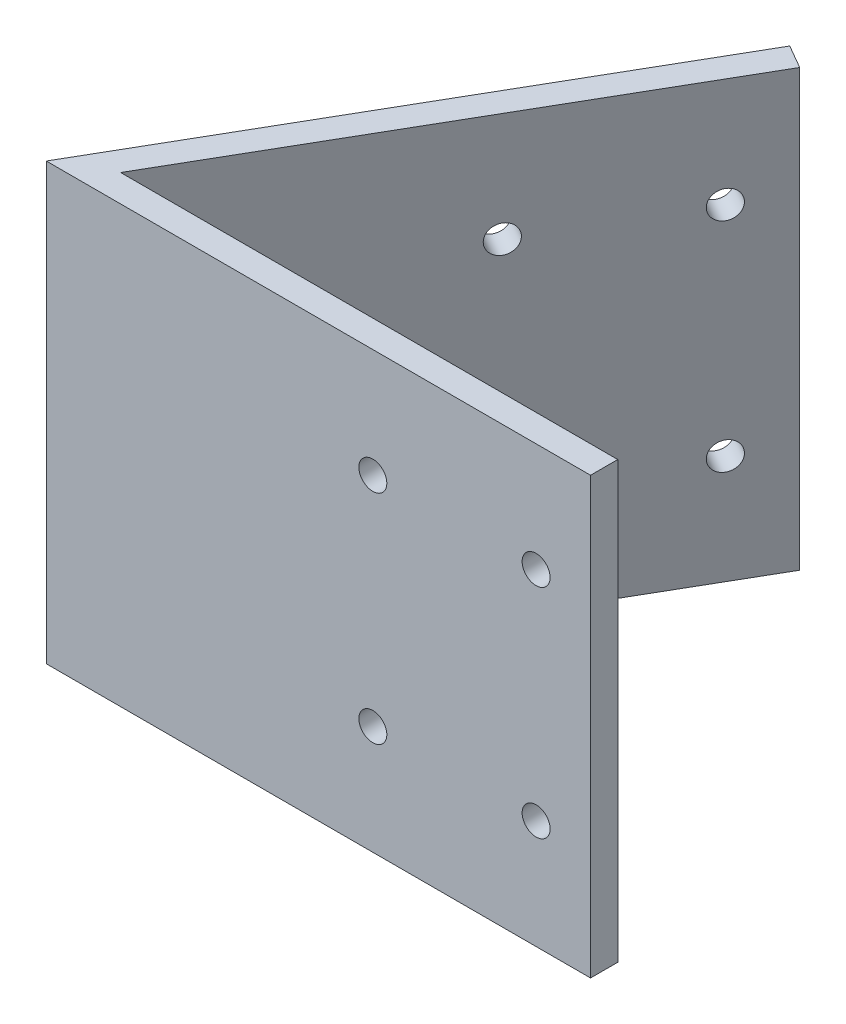
ISO-10303-21;
HEADER;
FILE_DESCRIPTION(('STEP AP214'),'2;1');
FILE_NAME('part.step','',(''),(''),'','','');
FILE_SCHEMA(('AUTOMOTIVE_DESIGN { 1 0 10303 214 1 1 1 1 }'));
ENDSEC;
DATA;
#1=APPLICATION_CONTEXT('core data for automotive mechanical design processes');
#2=APPLICATION_PROTOCOL_DEFINITION('international standard','automotive_design',2000,#1);
#3=PRODUCT_CONTEXT('',#1,'mechanical');
#4=PRODUCT('Part','Part','',(#3));
#5=PRODUCT_RELATED_PRODUCT_CATEGORY('part','',(#4));
#6=PRODUCT_DEFINITION_FORMATION('','',#4);
#7=PRODUCT_DEFINITION_CONTEXT('part definition',#1,'design');
#8=PRODUCT_DEFINITION('design','',#6,#7);
#9=PRODUCT_DEFINITION_SHAPE('','',#8);
#10=(LENGTH_UNIT() NAMED_UNIT(*) SI_UNIT(.MILLI.,.METRE.));
#11=(NAMED_UNIT(*) PLANE_ANGLE_UNIT() SI_UNIT($,.RADIAN.));
#12=(NAMED_UNIT(*) SI_UNIT($,.STERADIAN.) SOLID_ANGLE_UNIT());
#13=UNCERTAINTY_MEASURE_WITH_UNIT(LENGTH_MEASURE(1.E-05),#10,'distance_accuracy_value','');
#14=(GEOMETRIC_REPRESENTATION_CONTEXT(3) GLOBAL_UNCERTAINTY_ASSIGNED_CONTEXT((#13)) GLOBAL_UNIT_ASSIGNED_CONTEXT((#10,
#11,#12)) REPRESENTATION_CONTEXT('',''));
#15=CARTESIAN_POINT('',(0.,0.,0.));
#16=DIRECTION('',(0.,0.,1.));
#17=DIRECTION('',(1.,0.,0.));
#18=AXIS2_PLACEMENT_3D('',#15,#16,#17);
#19=CARTESIAN_POINT('',(63.5,50.8,0.));
#20=DIRECTION('',(0.,0.,-1.));
#21=DIRECTION('',(-1.,0.,0.));
#22=AXIS2_PLACEMENT_3D('',#19,#20,#21);
#23=PLANE('',#22);
#24=CARTESIAN_POINT('',(57.15,12.7,0.));
#25=DIRECTION('',(0.,0.,1.));
#26=DIRECTION('',(1.,0.,0.));
#27=AXIS2_PLACEMENT_3D('',#24,#25,#26);
#28=CIRCLE('',#27,1.63194999999999);
#29=CARTESIAN_POINT('',(58.78195,12.7,0.));
#30=VERTEX_POINT('',#29);
#31=EDGE_CURVE('E162',#30,#30,#28,.T.);
#32=ORIENTED_EDGE('',*,*,#31,.F.);
#33=EDGE_LOOP('',(#32));
#34=FACE_BOUND('',#33,.T.);
#35=DIRECTION('',(1.,0.,0.));
#36=VECTOR('',#35,1.);
#37=CARTESIAN_POINT('',(63.5,0.,0.));
#38=LINE('',#37,#36);
#39=CARTESIAN_POINT('',(0.,0.,0.));
#40=VERTEX_POINT('',#39);
#41=CARTESIAN_POINT('',(63.5,0.,0.));
#42=VERTEX_POINT('',#41);
#43=EDGE_CURVE('E116',#40,#42,#38,.T.);
#44=ORIENTED_EDGE('',*,*,#43,.T.);
#45=DIRECTION('',(0.,-1.,0.));
#46=VECTOR('',#45,1.);
#47=CARTESIAN_POINT('',(63.5,50.8,0.));
#48=LINE('',#47,#46);
#49=CARTESIAN_POINT('',(63.5,50.8,0.));
#50=VERTEX_POINT('',#49);
#51=EDGE_CURVE('E11',#50,#42,#48,.T.);
#52=ORIENTED_EDGE('',*,*,#51,.F.);
#53=DIRECTION('',(1.,0.,0.));
#54=VECTOR('',#53,1.);
#55=CARTESIAN_POINT('',(63.5,50.8,0.));
#56=LINE('',#55,#54);
#57=CARTESIAN_POINT('',(0.,50.8,0.));
#58=VERTEX_POINT('',#57);
#59=EDGE_CURVE('E127',#58,#50,#56,.T.);
#60=ORIENTED_EDGE('',*,*,#59,.F.);
#61=DIRECTION('',(0.,-1.,0.));
#62=VECTOR('',#61,1.);
#63=CARTESIAN_POINT('',(0.,50.8,0.));
#64=LINE('',#63,#62);
#65=EDGE_CURVE('E112',#58,#40,#64,.T.);
#66=ORIENTED_EDGE('',*,*,#65,.T.);
#67=EDGE_LOOP('',(#44,#52,#60,#66));
#68=FACE_BOUND('',#67,.T.);
#69=CARTESIAN_POINT('',(38.1,12.7,0.));
#70=DIRECTION('',(0.,0.,1.));
#71=DIRECTION('',(1.,0.,0.));
#72=AXIS2_PLACEMENT_3D('',#69,#70,#71);
#73=CIRCLE('',#72,1.63194999999999);
#74=CARTESIAN_POINT('',(39.73195,12.7,0.));
#75=VERTEX_POINT('',#74);
#76=EDGE_CURVE('E186',#75,#75,#73,.T.);
#77=ORIENTED_EDGE('',*,*,#76,.F.);
#78=EDGE_LOOP('',(#77));
#79=FACE_BOUND('',#78,.T.);
#80=CARTESIAN_POINT('',(38.1,38.1,0.));
#81=DIRECTION('',(0.,0.,1.));
#82=DIRECTION('',(1.,0.,0.));
#83=AXIS2_PLACEMENT_3D('',#80,#81,#82);
#84=CIRCLE('',#83,1.63194999999999);
#85=CARTESIAN_POINT('',(39.73195,38.1,0.));
#86=VERTEX_POINT('',#85);
#87=EDGE_CURVE('E180',#86,#86,#84,.T.);
#88=ORIENTED_EDGE('',*,*,#87,.F.);
#89=EDGE_LOOP('',(#88));
#90=FACE_BOUND('',#89,.T.);
#91=CARTESIAN_POINT('',(57.15,38.1,0.));
#92=DIRECTION('',(0.,0.,1.));
#93=DIRECTION('',(1.,0.,0.));
#94=AXIS2_PLACEMENT_3D('',#91,#92,#93);
#95=CIRCLE('',#94,1.63194999999999);
#96=CARTESIAN_POINT('',(58.78195,38.1,0.));
#97=VERTEX_POINT('',#96);
#98=EDGE_CURVE('E168',#97,#97,#95,.T.);
#99=ORIENTED_EDGE('',*,*,#98,.F.);
#100=EDGE_LOOP('',(#99));
#101=FACE_BOUND('',#100,.T.);
#102=ADVANCED_FACE('F32',(#34,#68,#79,#90,#101),#23,.F.);
#103=CARTESIAN_POINT('',(63.5,50.8,-3.175));
#104=DIRECTION('',(-1.,0.,0.));
#105=DIRECTION('',(0.,0.,1.));
#106=AXIS2_PLACEMENT_3D('',#103,#104,#105);
#107=PLANE('',#106);
#108=DIRECTION('',(0.,0.,-1.));
#109=VECTOR('',#108,1.);
#110=CARTESIAN_POINT('',(63.5,0.,-3.175));
#111=LINE('',#110,#109);
#112=CARTESIAN_POINT('',(63.5,0.,-3.175));
#113=VERTEX_POINT('',#112);
#114=EDGE_CURVE('E119',#42,#113,#111,.T.);
#115=ORIENTED_EDGE('',*,*,#114,.T.);
#116=DIRECTION('',(0.,-1.,0.));
#117=VECTOR('',#116,1.);
#118=CARTESIAN_POINT('',(63.5,50.8,-3.175));
#119=LINE('',#118,#117);
#120=CARTESIAN_POINT('',(63.5,50.8,-3.175));
#121=VERTEX_POINT('',#120);
#122=EDGE_CURVE('E40',#121,#113,#119,.T.);
#123=ORIENTED_EDGE('',*,*,#122,.F.);
#124=DIRECTION('',(0.,0.,-1.));
#125=VECTOR('',#124,1.);
#126=CARTESIAN_POINT('',(63.5,50.8,-3.175));
#127=LINE('',#126,#125);
#128=EDGE_CURVE('E85',#50,#121,#127,.T.);
#129=ORIENTED_EDGE('',*,*,#128,.F.);
#130=ORIENTED_EDGE('',*,*,#51,.T.);
#131=EDGE_LOOP('',(#115,#123,#129,#130));
#132=FACE_BOUND('',#131,.T.);
#133=ADVANCED_FACE('F155',(#132),#107,.F.);
#134=CARTESIAN_POINT('',(5.4992613140312,50.8,-3.17499999999999));
#135=DIRECTION('',(0.,0.,1.));
#136=DIRECTION('',(1.,0.,0.));
#137=AXIS2_PLACEMENT_3D('',#134,#135,#136);
#138=PLANE('',#137);
#139=CARTESIAN_POINT('',(57.15,12.7,-3.175));
#140=DIRECTION('',(0.,0.,1.));
#141=DIRECTION('',(1.,0.,0.));
#142=AXIS2_PLACEMENT_3D('',#139,#140,#141);
#143=CIRCLE('',#142,1.63194999999999);
#144=CARTESIAN_POINT('',(58.78195,12.7,-3.175));
#145=VERTEX_POINT('',#144);
#146=EDGE_CURVE('E164',#145,#145,#143,.T.);
#147=ORIENTED_EDGE('',*,*,#146,.T.);
#148=EDGE_LOOP('',(#147));
#149=FACE_BOUND('',#148,.T.);
#150=CARTESIAN_POINT('',(57.15,38.1,-3.175));
#151=DIRECTION('',(0.,0.,1.));
#152=DIRECTION('',(1.,0.,0.));
#153=AXIS2_PLACEMENT_3D('',#150,#151,#152);
#154=CIRCLE('',#153,1.63194999999999);
#155=CARTESIAN_POINT('',(58.78195,38.1,-3.175));
#156=VERTEX_POINT('',#155);
#157=EDGE_CURVE('E177',#156,#156,#154,.T.);
#158=ORIENTED_EDGE('',*,*,#157,.T.);
#159=EDGE_LOOP('',(#158));
#160=FACE_BOUND('',#159,.T.);
#161=CARTESIAN_POINT('',(38.1,38.1,-3.17499999999999));
#162=DIRECTION('',(0.,0.,1.));
#163=DIRECTION('',(1.,0.,0.));
#164=AXIS2_PLACEMENT_3D('',#161,#162,#163);
#165=CIRCLE('',#164,1.63194999999999);
#166=CARTESIAN_POINT('',(39.73195,38.1,-3.175));
#167=VERTEX_POINT('',#166);
#168=EDGE_CURVE('E183',#167,#167,#165,.T.);
#169=ORIENTED_EDGE('',*,*,#168,.T.);
#170=EDGE_LOOP('',(#169));
#171=FACE_BOUND('',#170,.T.);
#172=CARTESIAN_POINT('',(38.1,12.7,-3.17499999999999));
#173=DIRECTION('',(0.,0.,1.));
#174=DIRECTION('',(1.,0.,0.));
#175=AXIS2_PLACEMENT_3D('',#172,#173,#174);
#176=CIRCLE('',#175,1.63194999999999);
#177=CARTESIAN_POINT('',(39.73195,12.7,-3.175));
#178=VERTEX_POINT('',#177);
#179=EDGE_CURVE('E120',#178,#178,#176,.T.);
#180=ORIENTED_EDGE('',*,*,#179,.T.);
#181=EDGE_LOOP('',(#180));
#182=FACE_BOUND('',#181,.T.);
#183=DIRECTION('',(-1.,0.,0.));
#184=VECTOR('',#183,1.);
#185=CARTESIAN_POINT('',(5.4992613140312,0.,-3.17499999999999));
#186=LINE('',#185,#184);
#187=CARTESIAN_POINT('',(5.4992613140312,0.,-3.17499999999999));
#188=VERTEX_POINT('',#187);
#189=EDGE_CURVE('E122',#113,#188,#186,.T.);
#190=ORIENTED_EDGE('',*,*,#189,.T.);
#191=DIRECTION('',(0.,-1.,0.));
#192=VECTOR('',#191,1.);
#193=CARTESIAN_POINT('',(5.4992613140312,50.8,-3.17499999999999));
#194=LINE('',#193,#192);
#195=CARTESIAN_POINT('',(5.4992613140312,50.8,-3.17499999999999));
#196=VERTEX_POINT('',#195);
#197=EDGE_CURVE('E107',#196,#188,#194,.T.);
#198=ORIENTED_EDGE('',*,*,#197,.F.);
#199=DIRECTION('',(-1.,0.,0.));
#200=VECTOR('',#199,1.);
#201=CARTESIAN_POINT('',(5.4992613140312,50.8,-3.17499999999999));
#202=LINE('',#201,#200);
#203=EDGE_CURVE('E98',#121,#196,#202,.T.);
#204=ORIENTED_EDGE('',*,*,#203,.F.);
#205=ORIENTED_EDGE('',*,*,#122,.T.);
#206=EDGE_LOOP('',(#190,#198,#204,#205));
#207=FACE_BOUND('',#206,.T.);
#208=ADVANCED_FACE('F133',(#149,#160,#171,#182,#207),#138,.F.);
#209=CARTESIAN_POINT('',(34.4996306570158,50.8,-53.4051131403117));
#210=DIRECTION('',(-0.866025403784436,0.,-0.500000000000004));
#211=DIRECTION('',(-0.500000000000004,0.,0.866025403784437));
#212=AXIS2_PLACEMENT_3D('',#209,#210,#211);
#213=PLANE('',#212);
#214=CARTESIAN_POINT('',(31.3246306570158,38.1,-47.9058518262805));
#215=DIRECTION('',(-0.866025403784436,0.,-0.500000000000004));
#216=DIRECTION('',(-0.500000000000004,0.,0.866025403784437));
#217=AXIS2_PLACEMENT_3D('',#214,#215,#216);
#218=CIRCLE('',#217,1.63194999999999);
#219=CARTESIAN_POINT('',(30.5086556570158,38.1,-46.4925416685745));
#220=VERTEX_POINT('',#219);
#221=EDGE_CURVE('E310',#220,#220,#218,.T.);
#222=ORIENTED_EDGE('',*,*,#221,.T.);
#223=EDGE_LOOP('',(#222));
#224=FACE_BOUND('',#223,.T.);
#225=CARTESIAN_POINT('',(31.3246306570158,12.7,-47.9058518262805));
#226=DIRECTION('',(-0.866025403784436,0.,-0.500000000000004));
#227=DIRECTION('',(-0.500000000000004,0.,0.866025403784437));
#228=AXIS2_PLACEMENT_3D('',#225,#226,#227);
#229=CIRCLE('',#228,1.63194999999999);
#230=CARTESIAN_POINT('',(30.5086556570158,12.7,-46.4925416685745));
#231=VERTEX_POINT('',#230);
#232=EDGE_CURVE('E314',#231,#231,#229,.T.);
#233=ORIENTED_EDGE('',*,*,#232,.T.);
#234=EDGE_LOOP('',(#233));
#235=FACE_BOUND('',#234,.T.);
#236=CARTESIAN_POINT('',(21.7996306570157,12.7,-31.408067884187));
#237=DIRECTION('',(-0.866025403784436,0.,-0.500000000000004));
#238=DIRECTION('',(-0.500000000000004,0.,0.866025403784437));
#239=AXIS2_PLACEMENT_3D('',#236,#237,#238);
#240=CIRCLE('',#239,1.63194999999999);
#241=CARTESIAN_POINT('',(20.9836556570157,12.7,-29.994757726481));
#242=VERTEX_POINT('',#241);
#243=EDGE_CURVE('E323',#242,#242,#240,.T.);
#244=ORIENTED_EDGE('',*,*,#243,.T.);
#245=EDGE_LOOP('',(#244));
#246=FACE_BOUND('',#245,.T.);
#247=CARTESIAN_POINT('',(21.7996306570157,38.1,-31.408067884187));
#248=DIRECTION('',(-0.866025403784436,0.,-0.500000000000004));
#249=DIRECTION('',(-0.500000000000004,0.,0.866025403784437));
#250=AXIS2_PLACEMENT_3D('',#247,#248,#249);
#251=CIRCLE('',#250,1.63194999999999);
#252=CARTESIAN_POINT('',(20.9836556570157,38.1,-29.994757726481));
#253=VERTEX_POINT('',#252);
#254=EDGE_CURVE('E165',#253,#253,#251,.T.);
#255=ORIENTED_EDGE('',*,*,#254,.T.);
#256=EDGE_LOOP('',(#255));
#257=FACE_BOUND('',#256,.T.);
#258=DIRECTION('',(0.500000000000004,0.,-0.866025403784436));
#259=VECTOR('',#258,1.);
#260=CARTESIAN_POINT('',(34.4996306570158,0.,-53.4051131403117));
#261=LINE('',#260,#259);
#262=CARTESIAN_POINT('',(34.4996306570158,0.,-53.4051131403117));
#263=VERTEX_POINT('',#262);
#264=EDGE_CURVE('E106',#188,#263,#261,.T.);
#265=ORIENTED_EDGE('',*,*,#264,.T.);
#266=DIRECTION('',(0.,-1.,0.));
#267=VECTOR('',#266,1.);
#268=CARTESIAN_POINT('',(34.4996306570158,50.8,-53.4051131403117));
#269=LINE('',#268,#267);
#270=CARTESIAN_POINT('',(34.4996306570158,50.8,-53.4051131403117));
#271=VERTEX_POINT('',#270);
#272=EDGE_CURVE('E103',#271,#263,#269,.T.);
#273=ORIENTED_EDGE('',*,*,#272,.F.);
#274=DIRECTION('',(0.500000000000004,0.,-0.866025403784436));
#275=VECTOR('',#274,1.);
#276=CARTESIAN_POINT('',(34.4996306570158,50.8,-53.4051131403117));
#277=LINE('',#276,#275);
#278=EDGE_CURVE('E92',#196,#271,#277,.T.);
#279=ORIENTED_EDGE('',*,*,#278,.F.);
#280=ORIENTED_EDGE('',*,*,#197,.T.);
#281=EDGE_LOOP('',(#265,#273,#279,#280));
#282=FACE_BOUND('',#281,.T.);
#283=ADVANCED_FACE('F104',(#224,#235,#246,#257,#282),#213,.F.);
#284=CARTESIAN_POINT('',(31.7500000000002,50.8,-54.9926131403117));
#285=DIRECTION('',(-0.500000000000002,0.,0.866025403784438));
#286=DIRECTION('',(0.866025403784438,0.,0.500000000000002));
#287=AXIS2_PLACEMENT_3D('',#284,#285,#286);
#288=PLANE('',#287);
#289=DIRECTION('',(-0.866025403784438,0.,-0.500000000000002));
#290=VECTOR('',#289,1.);
#291=CARTESIAN_POINT('',(31.7500000000002,0.,-54.9926131403117));
#292=LINE('',#291,#290);
#293=CARTESIAN_POINT('',(31.7500000000002,0.,-54.9926131403117));
#294=VERTEX_POINT('',#293);
#295=EDGE_CURVE('E71',#263,#294,#292,.T.);
#296=ORIENTED_EDGE('',*,*,#295,.T.);
#297=DIRECTION('',(0.,-1.,0.));
#298=VECTOR('',#297,1.);
#299=CARTESIAN_POINT('',(31.7500000000002,50.8,-54.9926131403117));
#300=LINE('',#299,#298);
#301=CARTESIAN_POINT('',(31.7500000000002,50.8,-54.9926131403117));
#302=VERTEX_POINT('',#301);
#303=EDGE_CURVE('E108',#302,#294,#300,.T.);
#304=ORIENTED_EDGE('',*,*,#303,.F.);
#305=DIRECTION('',(-0.866025403784438,0.,-0.500000000000002));
#306=VECTOR('',#305,1.);
#307=CARTESIAN_POINT('',(31.7500000000002,50.8,-54.9926131403117));
#308=LINE('',#307,#306);
#309=EDGE_CURVE('E96',#271,#302,#308,.T.);
#310=ORIENTED_EDGE('',*,*,#309,.F.);
#311=ORIENTED_EDGE('',*,*,#272,.T.);
#312=EDGE_LOOP('',(#296,#304,#310,#311));
#313=FACE_BOUND('',#312,.T.);
#314=ADVANCED_FACE('F110',(#313),#288,.F.);
#315=CARTESIAN_POINT('',(0.,50.8,0.));
#316=DIRECTION('',(0.866025403784436,0.,0.500000000000004));
#317=DIRECTION('',(0.500000000000004,0.,-0.866025403784437));
#318=AXIS2_PLACEMENT_3D('',#315,#316,#317);
#319=PLANE('',#318);
#320=CARTESIAN_POINT('',(28.5750000000002,38.1,-49.4933518262805));
#321=DIRECTION('',(-0.866025403784436,0.,-0.500000000000004));
#322=DIRECTION('',(-0.500000000000004,0.,0.866025403784437));
#323=AXIS2_PLACEMENT_3D('',#320,#321,#322);
#324=CIRCLE('',#323,1.63194999999999);
#325=CARTESIAN_POINT('',(27.7590250000002,38.1,-48.0800416685745));
#326=VERTEX_POINT('',#325);
#327=EDGE_CURVE('E307',#326,#326,#324,.T.);
#328=ORIENTED_EDGE('',*,*,#327,.F.);
#329=EDGE_LOOP('',(#328));
#330=FACE_BOUND('',#329,.T.);
#331=CARTESIAN_POINT('',(28.5750000000002,12.7,-49.4933518262805));
#332=DIRECTION('',(-0.866025403784436,0.,-0.500000000000004));
#333=DIRECTION('',(-0.500000000000004,0.,0.866025403784437));
#334=AXIS2_PLACEMENT_3D('',#331,#332,#333);
#335=CIRCLE('',#334,1.63194999999999);
#336=CARTESIAN_POINT('',(27.7590250000002,12.7,-48.0800416685745));
#337=VERTEX_POINT('',#336);
#338=EDGE_CURVE('E311',#337,#337,#335,.T.);
#339=ORIENTED_EDGE('',*,*,#338,.F.);
#340=EDGE_LOOP('',(#339));
#341=FACE_BOUND('',#340,.T.);
#342=CARTESIAN_POINT('',(19.0500000000001,12.7,-32.995567884187));
#343=DIRECTION('',(-0.866025403784436,0.,-0.500000000000004));
#344=DIRECTION('',(-0.500000000000004,0.,0.866025403784437));
#345=AXIS2_PLACEMENT_3D('',#342,#343,#344);
#346=CIRCLE('',#345,1.63194999999999);
#347=CARTESIAN_POINT('',(18.2340250000001,12.7,-31.582257726481));
#348=VERTEX_POINT('',#347);
#349=EDGE_CURVE('E320',#348,#348,#346,.T.);
#350=ORIENTED_EDGE('',*,*,#349,.F.);
#351=EDGE_LOOP('',(#350));
#352=FACE_BOUND('',#351,.T.);
#353=CARTESIAN_POINT('',(19.0500000000001,38.1,-32.995567884187));
#354=DIRECTION('',(-0.866025403784436,0.,-0.500000000000004));
#355=DIRECTION('',(-0.500000000000004,0.,0.866025403784437));
#356=AXIS2_PLACEMENT_3D('',#353,#354,#355);
#357=CIRCLE('',#356,1.63194999999999);
#358=CARTESIAN_POINT('',(18.2340250000001,38.1,-31.582257726481));
#359=VERTEX_POINT('',#358);
#360=EDGE_CURVE('E171',#359,#359,#357,.T.);
#361=ORIENTED_EDGE('',*,*,#360,.F.);
#362=EDGE_LOOP('',(#361));
#363=FACE_BOUND('',#362,.T.);
#364=DIRECTION('',(-0.500000000000004,0.,0.866025403784436));
#365=VECTOR('',#364,1.);
#366=CARTESIAN_POINT('',(0.,0.,0.));
#367=LINE('',#366,#365);
#368=EDGE_CURVE('E77',#294,#40,#367,.T.);
#369=ORIENTED_EDGE('',*,*,#368,.T.);
#370=ORIENTED_EDGE('',*,*,#65,.F.);
#371=DIRECTION('',(-0.500000000000004,0.,0.866025403784436));
#372=VECTOR('',#371,1.);
#373=CARTESIAN_POINT('',(0.,50.8,0.));
#374=LINE('',#373,#372);
#375=EDGE_CURVE('E48',#302,#58,#374,.T.);
#376=ORIENTED_EDGE('',*,*,#375,.F.);
#377=ORIENTED_EDGE('',*,*,#303,.T.);
#378=EDGE_LOOP('',(#369,#370,#376,#377));
#379=FACE_BOUND('',#378,.T.);
#380=ADVANCED_FACE('F141',(#330,#341,#352,#363,#379),#319,.F.);
#381=CARTESIAN_POINT('',(0.,50.8,0.));
#382=DIRECTION('',(0.,1.,0.));
#383=DIRECTION('',(0.,0.,1.));
#384=AXIS2_PLACEMENT_3D('',#381,#382,#383);
#385=PLANE('',#384);
#386=ORIENTED_EDGE('',*,*,#59,.T.);
#387=ORIENTED_EDGE('',*,*,#128,.T.);
#388=ORIENTED_EDGE('',*,*,#203,.T.);
#389=ORIENTED_EDGE('',*,*,#278,.T.);
#390=ORIENTED_EDGE('',*,*,#309,.T.);
#391=ORIENTED_EDGE('',*,*,#375,.T.);
#392=EDGE_LOOP('',(#386,#387,#388,#389,#390,#391));
#393=FACE_BOUND('',#392,.T.);
#394=ADVANCED_FACE('F94',(#393),#385,.T.);
#395=CARTESIAN_POINT('',(0.,0.,0.));
#396=DIRECTION('',(0.,1.,0.));
#397=DIRECTION('',(0.,0.,1.));
#398=AXIS2_PLACEMENT_3D('',#395,#396,#397);
#399=PLANE('',#398);
#400=ORIENTED_EDGE('',*,*,#43,.F.);
#401=ORIENTED_EDGE('',*,*,#368,.F.);
#402=ORIENTED_EDGE('',*,*,#295,.F.);
#403=ORIENTED_EDGE('',*,*,#264,.F.);
#404=ORIENTED_EDGE('',*,*,#189,.F.);
#405=ORIENTED_EDGE('',*,*,#114,.F.);
#406=EDGE_LOOP('',(#400,#401,#402,#403,#404,#405));
#407=FACE_BOUND('',#406,.T.);
#408=ADVANCED_FACE('F136',(#407),#399,.F.);
#409=CARTESIAN_POINT('',(38.1,12.7,0.));
#410=DIRECTION('',(0.,0.,1.));
#411=DIRECTION('',(1.,0.,0.));
#412=AXIS2_PLACEMENT_3D('',#409,#410,#411);
#413=CYLINDRICAL_SURFACE('',#412,1.63194999999999);
#414=ORIENTED_EDGE('',*,*,#179,.F.);
#415=EDGE_LOOP('',(#414));
#416=FACE_BOUND('',#415,.T.);
#417=ORIENTED_EDGE('',*,*,#76,.T.);
#418=EDGE_LOOP('',(#417));
#419=FACE_BOUND('',#418,.T.);
#420=ADVANCED_FACE('F195',(#416,#419),#413,.F.);
#421=CARTESIAN_POINT('',(38.1,38.1,0.));
#422=DIRECTION('',(0.,0.,1.));
#423=DIRECTION('',(1.,0.,0.));
#424=AXIS2_PLACEMENT_3D('',#421,#422,#423);
#425=CYLINDRICAL_SURFACE('',#424,1.63194999999999);
#426=ORIENTED_EDGE('',*,*,#168,.F.);
#427=EDGE_LOOP('',(#426));
#428=FACE_BOUND('',#427,.T.);
#429=ORIENTED_EDGE('',*,*,#87,.T.);
#430=EDGE_LOOP('',(#429));
#431=FACE_BOUND('',#430,.T.);
#432=ADVANCED_FACE('F198',(#428,#431),#425,.F.);
#433=CARTESIAN_POINT('',(57.15,38.1,0.));
#434=DIRECTION('',(0.,0.,1.));
#435=DIRECTION('',(1.,0.,0.));
#436=AXIS2_PLACEMENT_3D('',#433,#434,#435);
#437=CYLINDRICAL_SURFACE('',#436,1.63194999999999);
#438=ORIENTED_EDGE('',*,*,#157,.F.);
#439=EDGE_LOOP('',(#438));
#440=FACE_BOUND('',#439,.T.);
#441=ORIENTED_EDGE('',*,*,#98,.T.);
#442=EDGE_LOOP('',(#441));
#443=FACE_BOUND('',#442,.T.);
#444=ADVANCED_FACE('F206',(#440,#443),#437,.F.);
#445=CARTESIAN_POINT('',(57.15,12.7,0.));
#446=DIRECTION('',(0.,0.,1.));
#447=DIRECTION('',(1.,0.,0.));
#448=AXIS2_PLACEMENT_3D('',#445,#446,#447);
#449=CYLINDRICAL_SURFACE('',#448,1.63194999999999);
#450=ORIENTED_EDGE('',*,*,#146,.F.);
#451=EDGE_LOOP('',(#450));
#452=FACE_BOUND('',#451,.T.);
#453=ORIENTED_EDGE('',*,*,#31,.T.);
#454=EDGE_LOOP('',(#453));
#455=FACE_BOUND('',#454,.T.);
#456=ADVANCED_FACE('F208',(#452,#455),#449,.F.);
#457=CARTESIAN_POINT('',(19.0500000000001,38.1,-32.995567884187));
#458=DIRECTION('',(-0.866025403784436,0.,-0.500000000000004));
#459=DIRECTION('',(-0.500000000000004,0.,0.866025403784437));
#460=AXIS2_PLACEMENT_3D('',#457,#458,#459);
#461=CYLINDRICAL_SURFACE('',#460,1.63194999999999);
#462=CARTESIAN_POINT('',(18.2340250000001,38.1,-31.582257726481));
#463=CARTESIAN_POINT('',(18.2626669860107,38.1,-31.5657212681477));
#464=CARTESIAN_POINT('',(18.2913089720213,38.1,-31.5491848098144));
#465=CARTESIAN_POINT('',(18.3485929440425,38.1,-31.5161118931477));
#466=CARTESIAN_POINT('',(18.377234930053,38.1,-31.4995754348144));
#467=CARTESIAN_POINT('',(18.4345189020742,38.1,-31.4665025181477));
#468=CARTESIAN_POINT('',(18.4631608880848,38.1,-31.4499660598144));
#469=CARTESIAN_POINT('',(18.5204448601059,38.1,-31.4168931431477));
#470=CARTESIAN_POINT('',(18.5490868461165,38.1,-31.4003566848144));
#471=CARTESIAN_POINT('',(18.6063708181377,38.1,-31.3672837681477));
#472=CARTESIAN_POINT('',(18.6350128041482,38.1,-31.3507473098144));
#473=CARTESIAN_POINT('',(18.6922967761694,38.1,-31.3176743931477));
#474=CARTESIAN_POINT('',(18.72093876218,38.1,-31.3011379348144));
#475=CARTESIAN_POINT('',(18.7782227342011,38.1,-31.2680650181477));
#476=CARTESIAN_POINT('',(18.8068647202117,38.1,-31.2515285598144));
#477=CARTESIAN_POINT('',(18.8641486922329,38.1,-31.2184556431477));
#478=CARTESIAN_POINT('',(18.8927906782435,38.1,-31.2019191848144));
#479=CARTESIAN_POINT('',(18.9500746502646,38.1,-31.1688462681477));
#480=CARTESIAN_POINT('',(18.9787166362752,38.1,-31.1523098098144));
#481=CARTESIAN_POINT('',(19.0360006082964,38.1,-31.1192368931477));
#482=CARTESIAN_POINT('',(19.0646425943069,38.1,-31.1027004348144));
#483=CARTESIAN_POINT('',(19.1219265663281,38.1,-31.0696275181477));
#484=CARTESIAN_POINT('',(19.1505685523387,38.1,-31.0530910598144));
#485=CARTESIAN_POINT('',(19.2078525243598,38.1,-31.0200181431477));
#486=CARTESIAN_POINT('',(19.2364945103704,38.1,-31.0034816848144));
#487=CARTESIAN_POINT('',(19.2937784823916,38.1,-30.9704087681477));
#488=CARTESIAN_POINT('',(19.3224204684021,38.1,-30.9538723098144));
#489=CARTESIAN_POINT('',(19.3797044404233,38.1,-30.9207993931477));
#490=CARTESIAN_POINT('',(19.4083464264339,38.1,-30.9042629348144));
#491=CARTESIAN_POINT('',(19.465630398455,38.1,-30.8711900181477));
#492=CARTESIAN_POINT('',(19.4942723844656,38.1,-30.8546535598144));
#493=CARTESIAN_POINT('',(19.5515563564868,38.1,-30.8215806431477));
#494=CARTESIAN_POINT('',(19.5801983424974,38.1,-30.8050441848144));
#495=CARTESIAN_POINT('',(19.6374823145185,38.1,-30.7719712681477));
#496=CARTESIAN_POINT('',(19.6661243005291,38.1,-30.7554348098144));
#497=CARTESIAN_POINT('',(19.7234082725502,38.1,-30.7223618931477));
#498=CARTESIAN_POINT('',(19.7520502585608,38.1,-30.7058254348144));
#499=CARTESIAN_POINT('',(19.809334230582,38.1,-30.6727525181477));
#500=CARTESIAN_POINT('',(19.8379762165926,38.1,-30.6562160598144));
#501=CARTESIAN_POINT('',(19.8952601886137,38.1,-30.6231431431477));
#502=CARTESIAN_POINT('',(19.9239021746243,38.1,-30.6066066848144));
#503=CARTESIAN_POINT('',(19.9811861466455,38.1,-30.5735337681477));
#504=CARTESIAN_POINT('',(20.009828132656,38.1,-30.5569973098143));
#505=CARTESIAN_POINT('',(20.0671121046772,38.1,-30.5239243931477));
#506=CARTESIAN_POINT('',(20.0957540906878,38.1,-30.5073879348143));
#507=CARTESIAN_POINT('',(20.1530380627089,38.1,-30.4743150181477));
#508=CARTESIAN_POINT('',(20.1816800487195,38.1,-30.4577785598144));
#509=CARTESIAN_POINT('',(20.2389640207407,38.1,-30.4247056431477));
#510=CARTESIAN_POINT('',(20.2676060067513,38.1,-30.4081691848144));
#511=CARTESIAN_POINT('',(20.3248899787724,38.1,-30.3750962681477));
#512=CARTESIAN_POINT('',(20.353531964783,38.1,-30.3585598098144));
#513=CARTESIAN_POINT('',(20.4108159368041,38.1,-30.3254868931477));
#514=CARTESIAN_POINT('',(20.4394579228147,38.1,-30.3089504348143));
#515=CARTESIAN_POINT('',(20.4967418948359,38.1,-30.2758775181477));
#516=CARTESIAN_POINT('',(20.5253838808465,38.1,-30.2593410598143));
#517=CARTESIAN_POINT('',(20.5826678528676,38.1,-30.2262681431477));
#518=CARTESIAN_POINT('',(20.6113098388782,38.1,-30.2097316848143));
#519=CARTESIAN_POINT('',(20.6685938108994,38.1,-30.1766587681477));
#520=CARTESIAN_POINT('',(20.6972357969099,38.1,-30.1601223098143));
#521=CARTESIAN_POINT('',(20.7545197689311,38.1,-30.1270493931477));
#522=CARTESIAN_POINT('',(20.7831617549417,38.1,-30.1105129348143));
#523=CARTESIAN_POINT('',(20.8404457269628,38.1,-30.0774400181477));
#524=CARTESIAN_POINT('',(20.8690877129734,38.1,-30.0609035598143));
#525=CARTESIAN_POINT('',(20.9263716849946,38.1,-30.0278306431477));
#526=CARTESIAN_POINT('',(20.9550136710051,38.1,-30.0112941848143));
#527=CARTESIAN_POINT('',(20.9836556570157,38.1,-29.994757726481));
#528=B_SPLINE_CURVE_WITH_KNOTS('',3,(#462,#463,#464,#465,#466,#467,#468,#469,#470,#471,#472,
#473,#474,#475,#476,#477,#478,#479,#480,#481,#482,#483,#484,#485,#486,#487,#488,#489,#490,#491,
#492,#493,#494,#495,#496,#497,#498,#499,#500,#501,#502,#503,#504,#505,#506,#507,#508,#509,#510,
#511,#512,#513,#514,#515,#516,#517,#518,#519,#520,#521,#522,#523,#524,#525,#526,#527),
.UNSPECIFIED.,.F.,.F.,(4,2,2,2,2,2,2,2,2,2,2,2,2,2,2,2,2,2,2,2,2,2,2,2,2,2,2,2,2,2,2,2,4),(0.,
0.0992187499999987,0.198437499999997,0.297656249999999,0.396875,0.496093749999995,
0.595312499999997,0.694531249999999,0.793749999999999,0.892968749999997,0.992187499999997,
1.09140625,1.190625,1.28984375,1.3890625,1.48828125,1.5875,1.68671875,1.7859375,1.88515625,
1.984375,2.08359375,2.1828125,2.28203125,2.38125,2.48046874999999,2.5796875,2.67890625,2.778125,
2.87734375,2.9765625,3.07578125,3.175),.UNSPECIFIED.);
#529=EDGE_CURVE('BSEAM215',#359,#253,#528,.T.);
#530=ORIENTED_EDGE('',*,*,#360,.T.);
#531=ORIENTED_EDGE('',*,*,#254,.F.);
#532=ORIENTED_EDGE('',*,*,#529,.T.);
#533=ORIENTED_EDGE('',*,*,#529,.F.);
#534=EDGE_LOOP('',(#530,#532,#531,#533));
#535=FACE_BOUND('',#534,.T.);
#536=ADVANCED_FACE('F215',(#535),#461,.F.);
#537=CARTESIAN_POINT('',(19.0500000000001,12.7,-32.995567884187));
#538=DIRECTION('',(-0.866025403784436,0.,-0.500000000000004));
#539=DIRECTION('',(-0.500000000000004,0.,0.866025403784437));
#540=AXIS2_PLACEMENT_3D('',#537,#538,#539);
#541=CYLINDRICAL_SURFACE('',#540,1.63194999999999);
#542=CARTESIAN_POINT('',(18.2340250000001,12.7,-31.582257726481));
#543=CARTESIAN_POINT('',(18.2626669860107,12.7,-31.5657212681477));
#544=CARTESIAN_POINT('',(18.2913089720213,12.7,-31.5491848098144));
#545=CARTESIAN_POINT('',(18.3485929440425,12.7,-31.5161118931477));
#546=CARTESIAN_POINT('',(18.377234930053,12.7,-31.4995754348144));
#547=CARTESIAN_POINT('',(18.4345189020742,12.7,-31.4665025181477));
#548=CARTESIAN_POINT('',(18.4631608880848,12.7,-31.4499660598144));
#549=CARTESIAN_POINT('',(18.5204448601059,12.7,-31.4168931431477));
#550=CARTESIAN_POINT('',(18.5490868461165,12.7,-31.4003566848144));
#551=CARTESIAN_POINT('',(18.6063708181377,12.7,-31.3672837681477));
#552=CARTESIAN_POINT('',(18.6350128041482,12.7,-31.3507473098144));
#553=CARTESIAN_POINT('',(18.6922967761694,12.7,-31.3176743931477));
#554=CARTESIAN_POINT('',(18.72093876218,12.7,-31.3011379348144));
#555=CARTESIAN_POINT('',(18.7782227342011,12.7,-31.2680650181477));
#556=CARTESIAN_POINT('',(18.8068647202117,12.7,-31.2515285598144));
#557=CARTESIAN_POINT('',(18.8641486922329,12.7,-31.2184556431477));
#558=CARTESIAN_POINT('',(18.8927906782435,12.7,-31.2019191848144));
#559=CARTESIAN_POINT('',(18.9500746502646,12.7,-31.1688462681477));
#560=CARTESIAN_POINT('',(18.9787166362752,12.7,-31.1523098098144));
#561=CARTESIAN_POINT('',(19.0360006082964,12.7,-31.1192368931477));
#562=CARTESIAN_POINT('',(19.0646425943069,12.7,-31.1027004348144));
#563=CARTESIAN_POINT('',(19.1219265663281,12.7,-31.0696275181477));
#564=CARTESIAN_POINT('',(19.1505685523387,12.7,-31.0530910598144));
#565=CARTESIAN_POINT('',(19.2078525243598,12.7,-31.0200181431477));
#566=CARTESIAN_POINT('',(19.2364945103704,12.7,-31.0034816848144));
#567=CARTESIAN_POINT('',(19.2937784823916,12.7,-30.9704087681477));
#568=CARTESIAN_POINT('',(19.3224204684021,12.7,-30.9538723098144));
#569=CARTESIAN_POINT('',(19.3797044404233,12.7,-30.9207993931477));
#570=CARTESIAN_POINT('',(19.4083464264339,12.7,-30.9042629348144));
#571=CARTESIAN_POINT('',(19.465630398455,12.7,-30.8711900181477));
#572=CARTESIAN_POINT('',(19.4942723844656,12.7,-30.8546535598144));
#573=CARTESIAN_POINT('',(19.5515563564868,12.7,-30.8215806431477));
#574=CARTESIAN_POINT('',(19.5801983424974,12.7,-30.8050441848144));
#575=CARTESIAN_POINT('',(19.6374823145185,12.7,-30.7719712681477));
#576=CARTESIAN_POINT('',(19.6661243005291,12.7,-30.7554348098144));
#577=CARTESIAN_POINT('',(19.7234082725502,12.7,-30.7223618931477));
#578=CARTESIAN_POINT('',(19.7520502585608,12.7,-30.7058254348144));
#579=CARTESIAN_POINT('',(19.809334230582,12.7,-30.6727525181477));
#580=CARTESIAN_POINT('',(19.8379762165926,12.7,-30.6562160598144));
#581=CARTESIAN_POINT('',(19.8952601886137,12.7,-30.6231431431477));
#582=CARTESIAN_POINT('',(19.9239021746243,12.7,-30.6066066848144));
#583=CARTESIAN_POINT('',(19.9811861466455,12.7,-30.5735337681477));
#584=CARTESIAN_POINT('',(20.009828132656,12.7,-30.5569973098143));
#585=CARTESIAN_POINT('',(20.0671121046772,12.7,-30.5239243931477));
#586=CARTESIAN_POINT('',(20.0957540906878,12.7,-30.5073879348143));
#587=CARTESIAN_POINT('',(20.1530380627089,12.7,-30.4743150181477));
#588=CARTESIAN_POINT('',(20.1816800487195,12.7,-30.4577785598144));
#589=CARTESIAN_POINT('',(20.2389640207407,12.7,-30.4247056431477));
#590=CARTESIAN_POINT('',(20.2676060067513,12.7,-30.4081691848144));
#591=CARTESIAN_POINT('',(20.3248899787724,12.7,-30.3750962681477));
#592=CARTESIAN_POINT('',(20.353531964783,12.7,-30.3585598098144));
#593=CARTESIAN_POINT('',(20.4108159368041,12.7,-30.3254868931477));
#594=CARTESIAN_POINT('',(20.4394579228147,12.7,-30.3089504348143));
#595=CARTESIAN_POINT('',(20.4967418948359,12.7,-30.2758775181477));
#596=CARTESIAN_POINT('',(20.5253838808465,12.7,-30.2593410598143));
#597=CARTESIAN_POINT('',(20.5826678528676,12.7,-30.2262681431477));
#598=CARTESIAN_POINT('',(20.6113098388782,12.7,-30.2097316848143));
#599=CARTESIAN_POINT('',(20.6685938108994,12.7,-30.1766587681477));
#600=CARTESIAN_POINT('',(20.6972357969099,12.7,-30.1601223098143));
#601=CARTESIAN_POINT('',(20.7545197689311,12.7,-30.1270493931477));
#602=CARTESIAN_POINT('',(20.7831617549417,12.7,-30.1105129348143));
#603=CARTESIAN_POINT('',(20.8404457269628,12.7,-30.0774400181477));
#604=CARTESIAN_POINT('',(20.8690877129734,12.7,-30.0609035598143));
#605=CARTESIAN_POINT('',(20.9263716849946,12.7,-30.0278306431477));
#606=CARTESIAN_POINT('',(20.9550136710051,12.7,-30.0112941848143));
#607=CARTESIAN_POINT('',(20.9836556570157,12.7,-29.994757726481));
#608=B_SPLINE_CURVE_WITH_KNOTS('',3,(#542,#543,#544,#545,#546,#547,#548,#549,#550,#551,#552,
#553,#554,#555,#556,#557,#558,#559,#560,#561,#562,#563,#564,#565,#566,#567,#568,#569,#570,#571,
#572,#573,#574,#575,#576,#577,#578,#579,#580,#581,#582,#583,#584,#585,#586,#587,#588,#589,#590,
#591,#592,#593,#594,#595,#596,#597,#598,#599,#600,#601,#602,#603,#604,#605,#606,#607),
.UNSPECIFIED.,.F.,.F.,(4,2,2,2,2,2,2,2,2,2,2,2,2,2,2,2,2,2,2,2,2,2,2,2,2,2,2,2,2,2,2,2,4),(0.,
0.0992187499999987,0.198437499999997,0.297656249999999,0.396875,0.496093749999995,
0.595312499999997,0.694531249999999,0.793749999999999,0.892968749999997,0.992187499999997,
1.09140625,1.190625,1.28984375,1.3890625,1.48828125,1.5875,1.68671875,1.7859375,1.88515625,
1.984375,2.08359375,2.1828125,2.28203125,2.38125,2.48046874999999,2.5796875,2.67890625,2.778125,
2.87734375,2.9765625,3.07578125,3.175),.UNSPECIFIED.);
#609=EDGE_CURVE('BSEAM272',#348,#242,#608,.T.);
#610=ORIENTED_EDGE('',*,*,#349,.T.);
#611=ORIENTED_EDGE('',*,*,#243,.F.);
#612=ORIENTED_EDGE('',*,*,#609,.T.);
#613=ORIENTED_EDGE('',*,*,#609,.F.);
#614=EDGE_LOOP('',(#610,#612,#611,#613));
#615=FACE_BOUND('',#614,.T.);
#616=ADVANCED_FACE('F272',(#615),#541,.F.);
#617=CARTESIAN_POINT('',(28.5750000000002,12.7,-49.4933518262805));
#618=DIRECTION('',(-0.866025403784436,0.,-0.500000000000004));
#619=DIRECTION('',(-0.500000000000004,0.,0.866025403784437));
#620=AXIS2_PLACEMENT_3D('',#617,#618,#619);
#621=CYLINDRICAL_SURFACE('',#620,1.63194999999999);
#622=CARTESIAN_POINT('',(27.7590250000002,12.7,-48.0800416685745));
#623=CARTESIAN_POINT('',(27.7876669860108,12.7,-48.0635052102412));
#624=CARTESIAN_POINT('',(27.8163089720214,12.7,-48.0469687519079));
#625=CARTESIAN_POINT('',(27.8735929440425,12.7,-48.0138958352412));
#626=CARTESIAN_POINT('',(27.9022349300531,12.7,-47.9973593769079));
#627=CARTESIAN_POINT('',(27.9595189020743,12.7,-47.9642864602412));
#628=CARTESIAN_POINT('',(27.9881608880848,12.7,-47.9477500019079));
#629=CARTESIAN_POINT('',(28.045444860106,12.7,-47.9146770852412));
#630=CARTESIAN_POINT('',(28.0740868461166,12.7,-47.8981406269079));
#631=CARTESIAN_POINT('',(28.1313708181377,12.7,-47.8650677102412));
#632=CARTESIAN_POINT('',(28.1600128041483,12.7,-47.8485312519079));
#633=CARTESIAN_POINT('',(28.2172967761695,12.7,-47.8154583352412));
#634=CARTESIAN_POINT('',(28.2459387621801,12.7,-47.7989218769079));
#635=CARTESIAN_POINT('',(28.3032227342012,12.7,-47.7658489602412));
#636=CARTESIAN_POINT('',(28.3318647202118,12.7,-47.7493125019079));
#637=CARTESIAN_POINT('',(28.389148692233,12.7,-47.7162395852412));
#638=CARTESIAN_POINT('',(28.4177906782435,12.7,-47.6997031269079));
#639=CARTESIAN_POINT('',(28.4750746502647,12.7,-47.6666302102412));
#640=CARTESIAN_POINT('',(28.5037166362753,12.7,-47.6500937519079));
#641=CARTESIAN_POINT('',(28.5610006082964,12.7,-47.6170208352412));
#642=CARTESIAN_POINT('',(28.589642594307,12.7,-47.6004843769079));
#643=CARTESIAN_POINT('',(28.6469265663282,12.7,-47.5674114602412));
#644=CARTESIAN_POINT('',(28.6755685523387,12.7,-47.5508750019079));
#645=CARTESIAN_POINT('',(28.7328525243599,12.7,-47.5178020852412));
#646=CARTESIAN_POINT('',(28.7614945103705,12.7,-47.5012656269079));
#647=CARTESIAN_POINT('',(28.8187784823916,12.7,-47.4681927102412));
#648=CARTESIAN_POINT('',(28.8474204684022,12.7,-47.4516562519079));
#649=CARTESIAN_POINT('',(28.9047044404234,12.7,-47.4185833352412));
#650=CARTESIAN_POINT('',(28.933346426434,12.7,-47.4020468769079));
#651=CARTESIAN_POINT('',(28.9906303984551,12.7,-47.3689739602412));
#652=CARTESIAN_POINT('',(29.0192723844657,12.7,-47.3524375019079));
#653=CARTESIAN_POINT('',(29.0765563564868,12.7,-47.3193645852412));
#654=CARTESIAN_POINT('',(29.1051983424974,12.7,-47.3028281269079));
#655=CARTESIAN_POINT('',(29.1624823145186,12.7,-47.2697552102412));
#656=CARTESIAN_POINT('',(29.1911243005292,12.7,-47.2532187519079));
#657=CARTESIAN_POINT('',(29.2484082725503,12.7,-47.2201458352412));
#658=CARTESIAN_POINT('',(29.2770502585609,12.7,-47.2036093769079));
#659=CARTESIAN_POINT('',(29.3343342305821,12.7,-47.1705364602412));
#660=CARTESIAN_POINT('',(29.3629762165926,12.7,-47.1540000019079));
#661=CARTESIAN_POINT('',(29.4202601886138,12.7,-47.1209270852412));
#662=CARTESIAN_POINT('',(29.4489021746244,12.7,-47.1043906269079));
#663=CARTESIAN_POINT('',(29.5061861466455,12.7,-47.0713177102412));
#664=CARTESIAN_POINT('',(29.5348281326561,12.7,-47.0547812519079));
#665=CARTESIAN_POINT('',(29.5921121046773,12.7,-47.0217083352412));
#666=CARTESIAN_POINT('',(29.6207540906878,12.7,-47.0051718769079));
#667=CARTESIAN_POINT('',(29.678038062709,12.7,-46.9720989602412));
#668=CARTESIAN_POINT('',(29.7066800487196,12.7,-46.9555625019079));
#669=CARTESIAN_POINT('',(29.7639640207407,12.7,-46.9224895852412));
#670=CARTESIAN_POINT('',(29.7926060067513,12.7,-46.9059531269079));
#671=CARTESIAN_POINT('',(29.8498899787725,12.7,-46.8728802102412));
#672=CARTESIAN_POINT('',(29.8785319647831,12.7,-46.8563437519079));
#673=CARTESIAN_POINT('',(29.9358159368042,12.7,-46.8232708352412));
#674=CARTESIAN_POINT('',(29.9644579228148,12.7,-46.8067343769079));
#675=CARTESIAN_POINT('',(30.0217418948359,12.7,-46.7736614602412));
#676=CARTESIAN_POINT('',(30.0503838808465,12.7,-46.7571250019079));
#677=CARTESIAN_POINT('',(30.1076678528677,12.7,-46.7240520852412));
#678=CARTESIAN_POINT('',(30.1363098388783,12.7,-46.7075156269079));
#679=CARTESIAN_POINT('',(30.1935938108994,12.7,-46.6744427102412));
#680=CARTESIAN_POINT('',(30.22223579691,12.7,-46.6579062519079));
#681=CARTESIAN_POINT('',(30.2795197689312,12.7,-46.6248333352412));
#682=CARTESIAN_POINT('',(30.3081617549417,12.7,-46.6082968769079));
#683=CARTESIAN_POINT('',(30.3654457269629,12.7,-46.5752239602412));
#684=CARTESIAN_POINT('',(30.3940877129735,12.7,-46.5586875019079));
#685=CARTESIAN_POINT('',(30.4513716849946,12.7,-46.5256145852412));
#686=CARTESIAN_POINT('',(30.4800136710052,12.7,-46.5090781269079));
#687=CARTESIAN_POINT('',(30.5086556570158,12.7,-46.4925416685745));
#688=B_SPLINE_CURVE_WITH_KNOTS('',3,(#622,#623,#624,#625,#626,#627,#628,#629,#630,#631,#632,
#633,#634,#635,#636,#637,#638,#639,#640,#641,#642,#643,#644,#645,#646,#647,#648,#649,#650,#651,
#652,#653,#654,#655,#656,#657,#658,#659,#660,#661,#662,#663,#664,#665,#666,#667,#668,#669,#670,
#671,#672,#673,#674,#675,#676,#677,#678,#679,#680,#681,#682,#683,#684,#685,#686,#687),
.UNSPECIFIED.,.F.,.F.,(4,2,2,2,2,2,2,2,2,2,2,2,2,2,2,2,2,2,2,2,2,2,2,2,2,2,2,2,2,2,2,2,4),(0.,
0.0992187499999987,0.198437499999997,0.297656249999999,0.396874999999997,0.496093749999995,
0.595312499999997,0.694531249999999,0.793749999999994,0.892968749999996,0.992187499999997,
1.09140625,1.19062499999999,1.28984375,1.3890625,1.48828124999999,1.58749999999999,1.68671875,
1.78593749999999,1.88515624999999,1.98437499999999,2.08359375,2.18281249999999,2.28203124999999,
2.38124999999999,2.48046874999999,2.57968749999999,2.67890624999999,2.77812499999999,
2.87734374999999,2.97656249999999,3.07578124999999,3.17499999999999),.UNSPECIFIED.);
#689=EDGE_CURVE('BSEAM281',#337,#231,#688,.T.);
#690=ORIENTED_EDGE('',*,*,#338,.T.);
#691=ORIENTED_EDGE('',*,*,#232,.F.);
#692=ORIENTED_EDGE('',*,*,#689,.T.);
#693=ORIENTED_EDGE('',*,*,#689,.F.);
#694=EDGE_LOOP('',(#690,#692,#691,#693));
#695=FACE_BOUND('',#694,.T.);
#696=ADVANCED_FACE('F281',(#695),#621,.F.);
#697=CARTESIAN_POINT('',(28.5750000000002,38.1,-49.4933518262805));
#698=DIRECTION('',(-0.866025403784436,0.,-0.500000000000004));
#699=DIRECTION('',(-0.500000000000004,0.,0.866025403784437));
#700=AXIS2_PLACEMENT_3D('',#697,#698,#699);
#701=CYLINDRICAL_SURFACE('',#700,1.63194999999999);
#702=CARTESIAN_POINT('',(27.7590250000002,38.1,-48.0800416685745));
#703=CARTESIAN_POINT('',(27.7876669860108,38.1,-48.0635052102412));
#704=CARTESIAN_POINT('',(27.8163089720214,38.1,-48.0469687519079));
#705=CARTESIAN_POINT('',(27.8735929440425,38.1,-48.0138958352412));
#706=CARTESIAN_POINT('',(27.9022349300531,38.1,-47.9973593769079));
#707=CARTESIAN_POINT('',(27.9595189020743,38.1,-47.9642864602412));
#708=CARTESIAN_POINT('',(27.9881608880848,38.1,-47.9477500019079));
#709=CARTESIAN_POINT('',(28.045444860106,38.1,-47.9146770852412));
#710=CARTESIAN_POINT('',(28.0740868461166,38.1,-47.8981406269079));
#711=CARTESIAN_POINT('',(28.1313708181377,38.1,-47.8650677102412));
#712=CARTESIAN_POINT('',(28.1600128041483,38.1,-47.8485312519079));
#713=CARTESIAN_POINT('',(28.2172967761695,38.1,-47.8154583352412));
#714=CARTESIAN_POINT('',(28.2459387621801,38.1,-47.7989218769079));
#715=CARTESIAN_POINT('',(28.3032227342012,38.1,-47.7658489602412));
#716=CARTESIAN_POINT('',(28.3318647202118,38.1,-47.7493125019079));
#717=CARTESIAN_POINT('',(28.389148692233,38.1,-47.7162395852412));
#718=CARTESIAN_POINT('',(28.4177906782435,38.1,-47.6997031269079));
#719=CARTESIAN_POINT('',(28.4750746502647,38.1,-47.6666302102412));
#720=CARTESIAN_POINT('',(28.5037166362753,38.1,-47.6500937519079));
#721=CARTESIAN_POINT('',(28.5610006082964,38.1,-47.6170208352412));
#722=CARTESIAN_POINT('',(28.589642594307,38.1,-47.6004843769079));
#723=CARTESIAN_POINT('',(28.6469265663282,38.1,-47.5674114602412));
#724=CARTESIAN_POINT('',(28.6755685523387,38.1,-47.5508750019079));
#725=CARTESIAN_POINT('',(28.7328525243599,38.1,-47.5178020852412));
#726=CARTESIAN_POINT('',(28.7614945103705,38.1,-47.5012656269079));
#727=CARTESIAN_POINT('',(28.8187784823916,38.1,-47.4681927102412));
#728=CARTESIAN_POINT('',(28.8474204684022,38.1,-47.4516562519079));
#729=CARTESIAN_POINT('',(28.9047044404234,38.1,-47.4185833352412));
#730=CARTESIAN_POINT('',(28.933346426434,38.1,-47.4020468769079));
#731=CARTESIAN_POINT('',(28.9906303984551,38.1,-47.3689739602412));
#732=CARTESIAN_POINT('',(29.0192723844657,38.1,-47.3524375019079));
#733=CARTESIAN_POINT('',(29.0765563564868,38.1,-47.3193645852412));
#734=CARTESIAN_POINT('',(29.1051983424974,38.1,-47.3028281269079));
#735=CARTESIAN_POINT('',(29.1624823145186,38.1,-47.2697552102412));
#736=CARTESIAN_POINT('',(29.1911243005292,38.1,-47.2532187519079));
#737=CARTESIAN_POINT('',(29.2484082725503,38.1,-47.2201458352412));
#738=CARTESIAN_POINT('',(29.2770502585609,38.1,-47.2036093769079));
#739=CARTESIAN_POINT('',(29.3343342305821,38.1,-47.1705364602412));
#740=CARTESIAN_POINT('',(29.3629762165926,38.1,-47.1540000019079));
#741=CARTESIAN_POINT('',(29.4202601886138,38.1,-47.1209270852412));
#742=CARTESIAN_POINT('',(29.4489021746244,38.1,-47.1043906269079));
#743=CARTESIAN_POINT('',(29.5061861466455,38.1,-47.0713177102412));
#744=CARTESIAN_POINT('',(29.5348281326561,38.1,-47.0547812519079));
#745=CARTESIAN_POINT('',(29.5921121046773,38.1,-47.0217083352412));
#746=CARTESIAN_POINT('',(29.6207540906878,38.1,-47.0051718769079));
#747=CARTESIAN_POINT('',(29.678038062709,38.1,-46.9720989602412));
#748=CARTESIAN_POINT('',(29.7066800487196,38.1,-46.9555625019079));
#749=CARTESIAN_POINT('',(29.7639640207407,38.1,-46.9224895852412));
#750=CARTESIAN_POINT('',(29.7926060067513,38.1,-46.9059531269079));
#751=CARTESIAN_POINT('',(29.8498899787725,38.1,-46.8728802102412));
#752=CARTESIAN_POINT('',(29.8785319647831,38.1,-46.8563437519079));
#753=CARTESIAN_POINT('',(29.9358159368042,38.1,-46.8232708352412));
#754=CARTESIAN_POINT('',(29.9644579228148,38.1,-46.8067343769079));
#755=CARTESIAN_POINT('',(30.0217418948359,38.1,-46.7736614602412));
#756=CARTESIAN_POINT('',(30.0503838808465,38.1,-46.7571250019079));
#757=CARTESIAN_POINT('',(30.1076678528677,38.1,-46.7240520852412));
#758=CARTESIAN_POINT('',(30.1363098388783,38.1,-46.7075156269079));
#759=CARTESIAN_POINT('',(30.1935938108994,38.1,-46.6744427102412));
#760=CARTESIAN_POINT('',(30.22223579691,38.1,-46.6579062519079));
#761=CARTESIAN_POINT('',(30.2795197689312,38.1,-46.6248333352412));
#762=CARTESIAN_POINT('',(30.3081617549417,38.1,-46.6082968769079));
#763=CARTESIAN_POINT('',(30.3654457269629,38.1,-46.5752239602412));
#764=CARTESIAN_POINT('',(30.3940877129735,38.1,-46.5586875019079));
#765=CARTESIAN_POINT('',(30.4513716849946,38.1,-46.5256145852412));
#766=CARTESIAN_POINT('',(30.4800136710052,38.1,-46.5090781269079));
#767=CARTESIAN_POINT('',(30.5086556570158,38.1,-46.4925416685745));
#768=B_SPLINE_CURVE_WITH_KNOTS('',3,(#702,#703,#704,#705,#706,#707,#708,#709,#710,#711,#712,
#713,#714,#715,#716,#717,#718,#719,#720,#721,#722,#723,#724,#725,#726,#727,#728,#729,#730,#731,
#732,#733,#734,#735,#736,#737,#738,#739,#740,#741,#742,#743,#744,#745,#746,#747,#748,#749,#750,
#751,#752,#753,#754,#755,#756,#757,#758,#759,#760,#761,#762,#763,#764,#765,#766,#767),
.UNSPECIFIED.,.F.,.F.,(4,2,2,2,2,2,2,2,2,2,2,2,2,2,2,2,2,2,2,2,2,2,2,2,2,2,2,2,2,2,2,2,4),(0.,
0.0992187499999987,0.198437499999997,0.297656249999999,0.396874999999997,0.496093749999995,
0.595312499999997,0.694531249999999,0.793749999999994,0.892968749999996,0.992187499999997,
1.09140625,1.19062499999999,1.28984375,1.3890625,1.48828124999999,1.58749999999999,1.68671875,
1.78593749999999,1.88515624999999,1.98437499999999,2.08359375,2.18281249999999,2.28203124999999,
2.38124999999999,2.48046874999999,2.57968749999999,2.67890624999999,2.77812499999999,
2.87734374999999,2.97656249999999,3.07578124999999,3.17499999999999),.UNSPECIFIED.);
#769=EDGE_CURVE('BSEAM291',#326,#220,#768,.T.);
#770=ORIENTED_EDGE('',*,*,#327,.T.);
#771=ORIENTED_EDGE('',*,*,#221,.F.);
#772=ORIENTED_EDGE('',*,*,#769,.T.);
#773=ORIENTED_EDGE('',*,*,#769,.F.);
#774=EDGE_LOOP('',(#770,#772,#771,#773));
#775=FACE_BOUND('',#774,.T.);
#776=ADVANCED_FACE('F291',(#775),#701,.F.);
#777=CLOSED_SHELL('',(#102,#133,#208,#283,#314,#380,#394,#408,#420,#432,#444,#456,#536,#616,
#696,#776));
#778=MANIFOLD_SOLID_BREP('B2',#777);
#779=ADVANCED_BREP_SHAPE_REPRESENTATION('',(#18,#778),#14);
#780=SHAPE_DEFINITION_REPRESENTATION(#9,#779);
ENDSEC;
END-ISO-10303-21;
